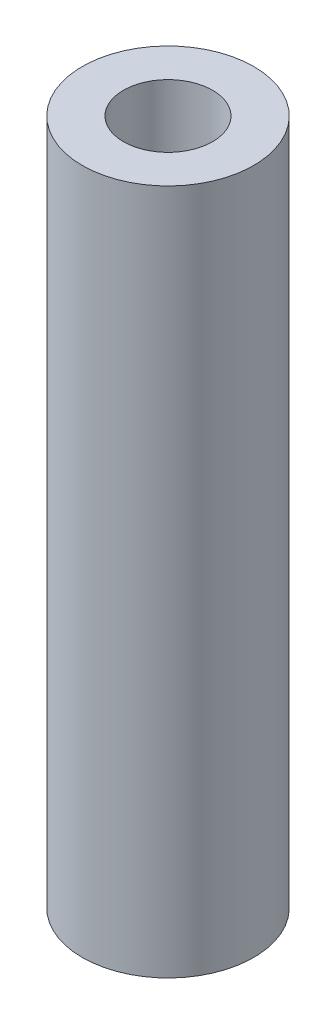
ISO-10303-21;
HEADER;
FILE_DESCRIPTION(('STEP AP214'),'2;1');
FILE_NAME('part.step','',(''),(''),'','','');
FILE_SCHEMA(('AUTOMOTIVE_DESIGN { 1 0 10303 214 1 1 1 1 }'));
ENDSEC;
DATA;
#1=APPLICATION_CONTEXT('core data for automotive mechanical design processes');
#2=APPLICATION_PROTOCOL_DEFINITION('international standard','automotive_design',2000,#1);
#3=PRODUCT_CONTEXT('',#1,'mechanical');
#4=PRODUCT('Part','Part','',(#3));
#5=PRODUCT_RELATED_PRODUCT_CATEGORY('part','',(#4));
#6=PRODUCT_DEFINITION_FORMATION('','',#4);
#7=PRODUCT_DEFINITION_CONTEXT('part definition',#1,'design');
#8=PRODUCT_DEFINITION('design','',#6,#7);
#9=PRODUCT_DEFINITION_SHAPE('','',#8);
#10=(LENGTH_UNIT() NAMED_UNIT(*) SI_UNIT(.MILLI.,.METRE.));
#11=(NAMED_UNIT(*) PLANE_ANGLE_UNIT() SI_UNIT($,.RADIAN.));
#12=(NAMED_UNIT(*) SI_UNIT($,.STERADIAN.) SOLID_ANGLE_UNIT());
#13=UNCERTAINTY_MEASURE_WITH_UNIT(LENGTH_MEASURE(1.E-05),#10,'distance_accuracy_value','');
#14=(GEOMETRIC_REPRESENTATION_CONTEXT(3) GLOBAL_UNCERTAINTY_ASSIGNED_CONTEXT((#13)) GLOBAL_UNIT_ASSIGNED_CONTEXT((#10,
#11,#12)) REPRESENTATION_CONTEXT('',''));
#15=CARTESIAN_POINT('',(0.,0.,0.));
#16=DIRECTION('',(0.,0.,1.));
#17=DIRECTION('',(1.,0.,0.));
#18=AXIS2_PLACEMENT_3D('',#15,#16,#17);
#19=CARTESIAN_POINT('',(0.,25.4,0.));
#20=DIRECTION('',(0.,1.,0.));
#21=DIRECTION('',(0.,0.,1.));
#22=AXIS2_PLACEMENT_3D('',#19,#20,#21);
#23=PLANE('',#22);
#24=CARTESIAN_POINT('',(0.,25.4,0.));
#25=DIRECTION('',(0.,1.,0.));
#26=DIRECTION('',(0.,0.,1.));
#27=AXIS2_PLACEMENT_3D('',#24,#25,#26);
#28=CIRCLE('',#27,6.35);
#29=CARTESIAN_POINT('',(0.,25.4,6.35));
#30=VERTEX_POINT('',#29);
#31=EDGE_CURVE('E10',#30,#30,#28,.T.);
#32=ORIENTED_EDGE('',*,*,#31,.T.);
#33=EDGE_LOOP('',(#32));
#34=FACE_BOUND('',#33,.T.);
#35=CARTESIAN_POINT('',(0.,25.4,0.));
#36=DIRECTION('',(0.,1.,0.));
#37=DIRECTION('',(0.,0.,1.));
#38=AXIS2_PLACEMENT_3D('',#35,#36,#37);
#39=CIRCLE('',#38,3.302);
#40=CARTESIAN_POINT('',(0.,25.4,3.302));
#41=VERTEX_POINT('',#40);
#42=EDGE_CURVE('E42',#41,#41,#39,.T.);
#43=ORIENTED_EDGE('',*,*,#42,.F.);
#44=EDGE_LOOP('',(#43));
#45=FACE_BOUND('',#44,.T.);
#46=ADVANCED_FACE('F31',(#34,#45),#23,.T.);
#47=CARTESIAN_POINT('',(0.,-25.4,0.));
#48=DIRECTION('',(0.,1.,0.));
#49=DIRECTION('',(0.,0.,1.));
#50=AXIS2_PLACEMENT_3D('',#47,#48,#49);
#51=PLANE('',#50);
#52=CARTESIAN_POINT('',(0.,-25.4,0.));
#53=DIRECTION('',(0.,1.,0.));
#54=DIRECTION('',(0.,0.,1.));
#55=AXIS2_PLACEMENT_3D('',#52,#53,#54);
#56=CIRCLE('',#55,6.35);
#57=CARTESIAN_POINT('',(0.,-25.4,6.35));
#58=VERTEX_POINT('',#57);
#59=EDGE_CURVE('E35',#58,#58,#56,.T.);
#60=ORIENTED_EDGE('',*,*,#59,.F.);
#61=EDGE_LOOP('',(#60));
#62=FACE_BOUND('',#61,.T.);
#63=CARTESIAN_POINT('',(0.,-25.4,0.));
#64=DIRECTION('',(0.,1.,0.));
#65=DIRECTION('',(0.,0.,1.));
#66=AXIS2_PLACEMENT_3D('',#63,#64,#65);
#67=CIRCLE('',#66,3.302);
#68=CARTESIAN_POINT('',(0.,-25.4,3.302));
#69=VERTEX_POINT('',#68);
#70=EDGE_CURVE('E44',#69,#69,#67,.T.);
#71=ORIENTED_EDGE('',*,*,#70,.T.);
#72=EDGE_LOOP('',(#71));
#73=FACE_BOUND('',#72,.T.);
#74=ADVANCED_FACE('F54',(#62,#73),#51,.F.);
#75=CARTESIAN_POINT('',(0.,25.4,0.));
#76=DIRECTION('',(0.,-1.,0.));
#77=DIRECTION('',(0.,0.,-1.));
#78=AXIS2_PLACEMENT_3D('',#75,#76,#77);
#79=CYLINDRICAL_SURFACE('',#78,6.35);
#80=ORIENTED_EDGE('',*,*,#31,.F.);
#81=EDGE_LOOP('',(#80));
#82=FACE_BOUND('',#81,.T.);
#83=ORIENTED_EDGE('',*,*,#59,.T.);
#84=EDGE_LOOP('',(#83));
#85=FACE_BOUND('',#84,.T.);
#86=ADVANCED_FACE('F33',(#82,#85),#79,.T.);
#87=CARTESIAN_POINT('',(0.,25.4,0.));
#88=DIRECTION('',(0.,-1.,0.));
#89=DIRECTION('',(0.,0.,-1.));
#90=AXIS2_PLACEMENT_3D('',#87,#88,#89);
#91=CYLINDRICAL_SURFACE('',#90,3.302);
#92=ORIENTED_EDGE('',*,*,#42,.T.);
#93=EDGE_LOOP('',(#92));
#94=FACE_BOUND('',#93,.T.);
#95=ORIENTED_EDGE('',*,*,#70,.F.);
#96=EDGE_LOOP('',(#95));
#97=FACE_BOUND('',#96,.T.);
#98=ADVANCED_FACE('F50',(#94,#97),#91,.F.);
#99=CLOSED_SHELL('',(#46,#74,#86,#98));
#100=MANIFOLD_SOLID_BREP('B2',#99);
#101=ADVANCED_BREP_SHAPE_REPRESENTATION('',(#18,#100),#14);
#102=SHAPE_DEFINITION_REPRESENTATION(#9,#101);
ENDSEC;
END-ISO-10303-21;
